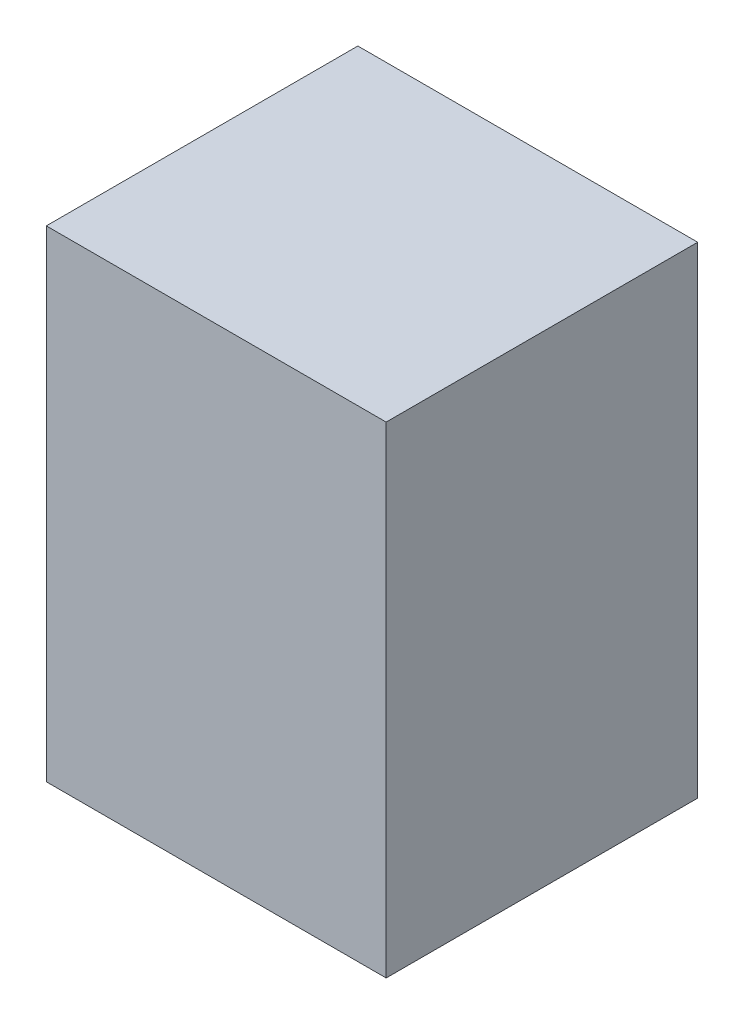
ISO-10303-21;
HEADER;
FILE_DESCRIPTION(('STEP AP214'),'2;1');
FILE_NAME('part.step','',(''),(''),'','','');
FILE_SCHEMA(('AUTOMOTIVE_DESIGN { 1 0 10303 214 1 1 1 1 }'));
ENDSEC;
DATA;
#1=APPLICATION_CONTEXT('core data for automotive mechanical design processes');
#2=APPLICATION_PROTOCOL_DEFINITION('international standard','automotive_design',2000,#1);
#3=PRODUCT_CONTEXT('',#1,'mechanical');
#4=PRODUCT('Part','Part','',(#3));
#5=PRODUCT_RELATED_PRODUCT_CATEGORY('part','',(#4));
#6=PRODUCT_DEFINITION_FORMATION('','',#4);
#7=PRODUCT_DEFINITION_CONTEXT('part definition',#1,'design');
#8=PRODUCT_DEFINITION('design','',#6,#7);
#9=PRODUCT_DEFINITION_SHAPE('','',#8);
#10=(LENGTH_UNIT() NAMED_UNIT(*) SI_UNIT(.MILLI.,.METRE.));
#11=(NAMED_UNIT(*) PLANE_ANGLE_UNIT() SI_UNIT($,.RADIAN.));
#12=(NAMED_UNIT(*) SI_UNIT($,.STERADIAN.) SOLID_ANGLE_UNIT());
#13=UNCERTAINTY_MEASURE_WITH_UNIT(LENGTH_MEASURE(1.E-05),#10,'distance_accuracy_value','');
#14=(GEOMETRIC_REPRESENTATION_CONTEXT(3) GLOBAL_UNCERTAINTY_ASSIGNED_CONTEXT((#13)) GLOBAL_UNIT_ASSIGNED_CONTEXT((#10,
#11,#12)) REPRESENTATION_CONTEXT('',''));
#15=CARTESIAN_POINT('',(0.,0.,0.));
#16=DIRECTION('',(0.,0.,1.));
#17=DIRECTION('',(1.,0.,0.));
#18=AXIS2_PLACEMENT_3D('',#15,#16,#17);
#19=CARTESIAN_POINT('',(4.1,15.,4.1));
#20=DIRECTION('',(0.,-1.,0.));
#21=DIRECTION('',(0.,0.,-1.));
#22=AXIS2_PLACEMENT_3D('',#19,#20,#21);
#23=PLANE('',#22);
#24=DIRECTION('',(-1.,0.,0.));
#25=VECTOR('',#24,1.);
#26=CARTESIAN_POINT('',(4.1,15.,4.1));
#27=LINE('',#26,#25);
#28=CARTESIAN_POINT('',(2.97988901220869,15.,4.1));
#29=VERTEX_POINT('',#28);
#30=CARTESIAN_POINT('',(-2.97988901220868,15.,4.1));
#31=VERTEX_POINT('',#30);
#32=EDGE_CURVE('E168',#29,#31,#27,.T.);
#33=ORIENTED_EDGE('',*,*,#32,.T.);
#34=DIRECTION('',(0.664178367353853,0.,0.747574141031623));
#35=VECTOR('',#34,1.);
#36=CARTESIAN_POINT('',(0.143282985343345,15.,7.61532470511805));
#37=LINE('',#36,#35);
#38=CARTESIAN_POINT('',(-4.1,15.,2.83924528301889));
#39=VERTEX_POINT('',#38);
#40=EDGE_CURVE('E38',#31,#39,#37,.F.);
#41=ORIENTED_EDGE('',*,*,#40,.T.);
#42=DIRECTION('',(0.,0.,-1.));
#43=VECTOR('',#42,1.);
#44=CARTESIAN_POINT('',(-4.1,15.,4.1));
#45=LINE('',#44,#43);
#46=CARTESIAN_POINT('',(-4.1,15.,-4.1));
#47=VERTEX_POINT('',#46);
#48=EDGE_CURVE('E171',#39,#47,#45,.T.);
#49=ORIENTED_EDGE('',*,*,#48,.T.);
#50=DIRECTION('',(1.,0.,0.));
#51=VECTOR('',#50,1.);
#52=CARTESIAN_POINT('',(-4.1,15.,-4.1));
#53=LINE('',#52,#51);
#54=CARTESIAN_POINT('',(4.1,15.,-4.1));
#55=VERTEX_POINT('',#54);
#56=EDGE_CURVE('E173',#47,#55,#53,.T.);
#57=ORIENTED_EDGE('',*,*,#56,.T.);
#58=DIRECTION('',(0.,0.,1.));
#59=VECTOR('',#58,1.);
#60=CARTESIAN_POINT('',(4.1,15.,-4.1));
#61=LINE('',#60,#59);
#62=CARTESIAN_POINT('',(4.1,15.,2.83924528301889));
#63=VERTEX_POINT('',#62);
#64=EDGE_CURVE('E165',#55,#63,#61,.T.);
#65=ORIENTED_EDGE('',*,*,#64,.T.);
#66=DIRECTION('',(0.664178367353848,0.,-0.747574141031628));
#67=VECTOR('',#66,1.);
#68=CARTESIAN_POINT('',(3.47400682467546,15.,3.54383961089404));
#69=LINE('',#68,#67);
#70=EDGE_CURVE('E223',#63,#29,#69,.F.);
#71=ORIENTED_EDGE('',*,*,#70,.T.);
#72=EDGE_LOOP('',(#33,#41,#49,#57,#65,#71));
#73=FACE_BOUND('',#72,.T.);
#74=DIRECTION('',(1.,0.,0.));
#75=VECTOR('',#74,1.);
#76=CARTESIAN_POINT('',(3.,15.,-1.5));
#77=LINE('',#76,#75);
#78=CARTESIAN_POINT('',(-3.,15.,-1.5));
#79=VERTEX_POINT('',#78);
#80=CARTESIAN_POINT('',(3.,15.,-1.5));
#81=VERTEX_POINT('',#80);
#82=EDGE_CURVE('E427',#79,#81,#77,.T.);
#83=ORIENTED_EDGE('',*,*,#82,.F.);
#84=DIRECTION('',(0.,0.,-1.));
#85=VECTOR('',#84,1.);
#86=CARTESIAN_POINT('',(-3.,15.,-1.5));
#87=LINE('',#86,#85);
#88=CARTESIAN_POINT('',(-3.,15.,1.5));
#89=VERTEX_POINT('',#88);
#90=EDGE_CURVE('E154',#89,#79,#87,.T.);
#91=ORIENTED_EDGE('',*,*,#90,.F.);
#92=DIRECTION('',(-1.,0.,0.));
#93=VECTOR('',#92,1.);
#94=CARTESIAN_POINT('',(-3.,15.,1.5));
#95=LINE('',#94,#93);
#96=CARTESIAN_POINT('',(3.,15.,1.5));
#97=VERTEX_POINT('',#96);
#98=EDGE_CURVE('E150',#97,#89,#95,.T.);
#99=ORIENTED_EDGE('',*,*,#98,.F.);
#100=DIRECTION('',(0.,0.,1.));
#101=VECTOR('',#100,1.);
#102=CARTESIAN_POINT('',(3.,15.,1.5));
#103=LINE('',#102,#101);
#104=EDGE_CURVE('E424',#81,#97,#103,.T.);
#105=ORIENTED_EDGE('',*,*,#104,.F.);
#106=EDGE_LOOP('',(#83,#91,#99,#105));
#107=FACE_BOUND('',#106,.T.);
#108=ADVANCED_FACE('F30',(#73,#107),#23,.T.);
#109=CARTESIAN_POINT('',(6.,17.,5.5));
#110=DIRECTION('',(1.,0.,0.));
#111=DIRECTION('',(0.,0.,-1.));
#112=AXIS2_PLACEMENT_3D('',#109,#110,#111);
#113=PLANE('',#112);
#114=DIRECTION('',(0.,-1.,0.));
#115=VECTOR('',#114,1.);
#116=CARTESIAN_POINT('',(6.,17.,-5.5));
#117=LINE('',#116,#115);
#118=CARTESIAN_POINT('',(6.,17.,-5.5));
#119=VERTEX_POINT('',#118);
#120=CARTESIAN_POINT('',(6.,0.,-5.5));
#121=VERTEX_POINT('',#120);
#122=EDGE_CURVE('E184',#119,#121,#117,.T.);
#123=ORIENTED_EDGE('',*,*,#122,.F.);
#124=DIRECTION('',(0.,0.,-1.));
#125=VECTOR('',#124,1.);
#126=CARTESIAN_POINT('',(6.,17.,5.5));
#127=LINE('',#126,#125);
#128=CARTESIAN_POINT('',(6.,17.,5.5));
#129=VERTEX_POINT('',#128);
#130=EDGE_CURVE('E211',#129,#119,#127,.T.);
#131=ORIENTED_EDGE('',*,*,#130,.F.);
#132=DIRECTION('',(0.,-1.,0.));
#133=VECTOR('',#132,1.);
#134=CARTESIAN_POINT('',(6.,17.,5.5));
#135=LINE('',#134,#133);
#136=CARTESIAN_POINT('',(6.,0.,5.5));
#137=VERTEX_POINT('',#136);
#138=EDGE_CURVE('E187',#129,#137,#135,.T.);
#139=ORIENTED_EDGE('',*,*,#138,.T.);
#140=DIRECTION('',(0.,0.,-1.));
#141=VECTOR('',#140,1.);
#142=CARTESIAN_POINT('',(6.,0.,5.5));
#143=LINE('',#142,#141);
#144=EDGE_CURVE('E200',#137,#121,#143,.T.);
#145=ORIENTED_EDGE('',*,*,#144,.T.);
#146=EDGE_LOOP('',(#123,#131,#139,#145));
#147=FACE_BOUND('',#146,.T.);
#148=ADVANCED_FACE('F247',(#147),#113,.T.);
#149=CARTESIAN_POINT('',(-6.,17.,5.5));
#150=DIRECTION('',(0.,1.,0.));
#151=DIRECTION('',(0.,0.,1.));
#152=AXIS2_PLACEMENT_3D('',#149,#150,#151);
#153=PLANE('',#152);
#154=DIRECTION('',(1.,0.,0.));
#155=VECTOR('',#154,1.);
#156=CARTESIAN_POINT('',(-6.,17.,-5.5));
#157=LINE('',#156,#155);
#158=CARTESIAN_POINT('',(-6.,17.,-5.5));
#159=VERTEX_POINT('',#158);
#160=EDGE_CURVE('E191',#159,#119,#157,.T.);
#161=ORIENTED_EDGE('',*,*,#160,.F.);
#162=DIRECTION('',(0.,0.,-1.));
#163=VECTOR('',#162,1.);
#164=CARTESIAN_POINT('',(-6.,17.,5.5));
#165=LINE('',#164,#163);
#166=CARTESIAN_POINT('',(-6.,17.,5.5));
#167=VERTEX_POINT('',#166);
#168=EDGE_CURVE('E214',#167,#159,#165,.T.);
#169=ORIENTED_EDGE('',*,*,#168,.F.);
#170=DIRECTION('',(1.,0.,0.));
#171=VECTOR('',#170,1.);
#172=CARTESIAN_POINT('',(-6.,17.,5.5));
#173=LINE('',#172,#171);
#174=EDGE_CURVE('E197',#167,#129,#173,.T.);
#175=ORIENTED_EDGE('',*,*,#174,.T.);
#176=ORIENTED_EDGE('',*,*,#130,.T.);
#177=EDGE_LOOP('',(#161,#169,#175,#176));
#178=FACE_BOUND('',#177,.T.);
#179=ADVANCED_FACE('F252',(#178),#153,.T.);
#180=CARTESIAN_POINT('',(-6.,0.,5.5));
#181=DIRECTION('',(-1.,0.,0.));
#182=DIRECTION('',(0.,0.,1.));
#183=AXIS2_PLACEMENT_3D('',#180,#181,#182);
#184=PLANE('',#183);
#185=DIRECTION('',(0.,1.,0.));
#186=VECTOR('',#185,1.);
#187=CARTESIAN_POINT('',(-6.,0.,-5.5));
#188=LINE('',#187,#186);
#189=CARTESIAN_POINT('',(-6.,0.,-5.5));
#190=VERTEX_POINT('',#189);
#191=EDGE_CURVE('E206',#190,#159,#188,.T.);
#192=ORIENTED_EDGE('',*,*,#191,.F.);
#193=DIRECTION('',(0.,0.,-1.));
#194=VECTOR('',#193,1.);
#195=CARTESIAN_POINT('',(-6.,0.,5.5));
#196=LINE('',#195,#194);
#197=CARTESIAN_POINT('',(-6.,0.,5.5));
#198=VERTEX_POINT('',#197);
#199=EDGE_CURVE('E216',#198,#190,#196,.T.);
#200=ORIENTED_EDGE('',*,*,#199,.F.);
#201=DIRECTION('',(0.,1.,0.));
#202=VECTOR('',#201,1.);
#203=CARTESIAN_POINT('',(-6.,0.,5.5));
#204=LINE('',#203,#202);
#205=EDGE_CURVE('E194',#198,#167,#204,.T.);
#206=ORIENTED_EDGE('',*,*,#205,.T.);
#207=ORIENTED_EDGE('',*,*,#168,.T.);
#208=EDGE_LOOP('',(#192,#200,#206,#207));
#209=FACE_BOUND('',#208,.T.);
#210=ADVANCED_FACE('F282',(#209),#184,.T.);
#211=CARTESIAN_POINT('',(6.,0.,5.5));
#212=DIRECTION('',(0.,-1.,0.));
#213=DIRECTION('',(0.,0.,-1.));
#214=AXIS2_PLACEMENT_3D('',#211,#212,#213);
#215=PLANE('',#214);
#216=DIRECTION('',(0.,0.,1.));
#217=VECTOR('',#216,1.);
#218=CARTESIAN_POINT('',(4.1,0.,-4.1));
#219=LINE('',#218,#217);
#220=CARTESIAN_POINT('',(4.1,0.,-4.1));
#221=VERTEX_POINT('',#220);
#222=CARTESIAN_POINT('',(4.1,0.,2.83924528301889));
#223=VERTEX_POINT('',#222);
#224=EDGE_CURVE('E156',#221,#223,#219,.T.);
#225=ORIENTED_EDGE('',*,*,#224,.F.);
#226=DIRECTION('',(1.,0.,0.));
#227=VECTOR('',#226,1.);
#228=CARTESIAN_POINT('',(-4.1,0.,-4.1));
#229=LINE('',#228,#227);
#230=CARTESIAN_POINT('',(-4.1,0.,-4.1));
#231=VERTEX_POINT('',#230);
#232=EDGE_CURVE('E169',#231,#221,#229,.T.);
#233=ORIENTED_EDGE('',*,*,#232,.F.);
#234=DIRECTION('',(0.,0.,-1.));
#235=VECTOR('',#234,1.);
#236=CARTESIAN_POINT('',(-4.1,0.,4.1));
#237=LINE('',#236,#235);
#238=CARTESIAN_POINT('',(-4.1,0.,2.83924528301889));
#239=VERTEX_POINT('',#238);
#240=EDGE_CURVE('E178',#239,#231,#237,.T.);
#241=ORIENTED_EDGE('',*,*,#240,.F.);
#242=DIRECTION('',(-0.664178367353853,0.,-0.747574141031623));
#243=VECTOR('',#242,1.);
#244=CARTESIAN_POINT('',(-4.1,0.,2.83924528301889));
#245=LINE('',#244,#243);
#246=CARTESIAN_POINT('',(-2.97988901220868,0.,4.1));
#247=VERTEX_POINT('',#246);
#248=EDGE_CURVE('E11',#239,#247,#245,.F.);
#249=ORIENTED_EDGE('',*,*,#248,.T.);
#250=DIRECTION('',(-1.,0.,0.));
#251=VECTOR('',#250,1.);
#252=CARTESIAN_POINT('',(4.1,0.,4.1));
#253=LINE('',#252,#251);
#254=CARTESIAN_POINT('',(2.97988901220869,0.,4.1));
#255=VERTEX_POINT('',#254);
#256=EDGE_CURVE('E159',#255,#247,#253,.T.);
#257=ORIENTED_EDGE('',*,*,#256,.F.);
#258=DIRECTION('',(-0.664178367353848,0.,0.747574141031628));
#259=VECTOR('',#258,1.);
#260=CARTESIAN_POINT('',(2.97988901220869,0.,4.1));
#261=LINE('',#260,#259);
#262=EDGE_CURVE('E225',#255,#223,#261,.F.);
#263=ORIENTED_EDGE('',*,*,#262,.T.);
#264=EDGE_LOOP('',(#225,#233,#241,#249,#257,#263));
#265=FACE_BOUND('',#264,.T.);
#266=DIRECTION('',(-1.,0.,0.));
#267=VECTOR('',#266,1.);
#268=CARTESIAN_POINT('',(6.,0.,-5.5));
#269=LINE('',#268,#267);
#270=EDGE_CURVE('E203',#121,#190,#269,.T.);
#271=ORIENTED_EDGE('',*,*,#270,.F.);
#272=ORIENTED_EDGE('',*,*,#144,.F.);
#273=DIRECTION('',(-1.,0.,0.));
#274=VECTOR('',#273,1.);
#275=CARTESIAN_POINT('',(6.,0.,5.5));
#276=LINE('',#275,#274);
#277=EDGE_CURVE('E190',#137,#198,#276,.T.);
#278=ORIENTED_EDGE('',*,*,#277,.T.);
#279=ORIENTED_EDGE('',*,*,#199,.T.);
#280=EDGE_LOOP('',(#271,#272,#278,#279));
#281=FACE_BOUND('',#280,.T.);
#282=ADVANCED_FACE('F275',(#265,#281),#215,.T.);
#283=CARTESIAN_POINT('',(6.,0.,5.5));
#284=DIRECTION('',(0.,0.,-1.));
#285=DIRECTION('',(-1.,0.,0.));
#286=AXIS2_PLACEMENT_3D('',#283,#284,#285);
#287=PLANE('',#286);
#288=ORIENTED_EDGE('',*,*,#138,.F.);
#289=ORIENTED_EDGE('',*,*,#174,.F.);
#290=ORIENTED_EDGE('',*,*,#205,.F.);
#291=ORIENTED_EDGE('',*,*,#277,.F.);
#292=EDGE_LOOP('',(#288,#289,#290,#291));
#293=FACE_BOUND('',#292,.T.);
#294=ADVANCED_FACE('F272',(#293),#287,.F.);
#295=CARTESIAN_POINT('',(6.,0.,-5.5));
#296=DIRECTION('',(0.,0.,-1.));
#297=DIRECTION('',(-1.,0.,0.));
#298=AXIS2_PLACEMENT_3D('',#295,#296,#297);
#299=PLANE('',#298);
#300=ORIENTED_EDGE('',*,*,#122,.T.);
#301=ORIENTED_EDGE('',*,*,#270,.T.);
#302=ORIENTED_EDGE('',*,*,#191,.T.);
#303=ORIENTED_EDGE('',*,*,#160,.T.);
#304=EDGE_LOOP('',(#300,#301,#302,#303));
#305=FACE_BOUND('',#304,.T.);
#306=ADVANCED_FACE('F270',(#305),#299,.T.);
#307=CARTESIAN_POINT('',(4.1,15.,-4.1));
#308=DIRECTION('',(1.,0.,0.));
#309=DIRECTION('',(0.,0.,-1.));
#310=AXIS2_PLACEMENT_3D('',#307,#308,#309);
#311=PLANE('',#310);
#312=ORIENTED_EDGE('',*,*,#224,.T.);
#313=DIRECTION('',(0.,1.,0.));
#314=VECTOR('',#313,1.);
#315=CARTESIAN_POINT('',(4.1,15.,2.83924528301889));
#316=LINE('',#315,#314);
#317=EDGE_CURVE('E221',#223,#63,#316,.T.);
#318=ORIENTED_EDGE('',*,*,#317,.T.);
#319=ORIENTED_EDGE('',*,*,#64,.F.);
#320=DIRECTION('',(0.,-1.,0.));
#321=VECTOR('',#320,1.);
#322=CARTESIAN_POINT('',(4.1,15.,-4.1));
#323=LINE('',#322,#321);
#324=EDGE_CURVE('E182',#55,#221,#323,.T.);
#325=ORIENTED_EDGE('',*,*,#324,.T.);
#326=EDGE_LOOP('',(#312,#318,#319,#325));
#327=FACE_BOUND('',#326,.T.);
#328=ADVANCED_FACE('F261',(#327),#311,.F.);
#329=CARTESIAN_POINT('',(-4.1,15.,-4.1));
#330=DIRECTION('',(0.,0.,-1.));
#331=DIRECTION('',(-1.,0.,0.));
#332=AXIS2_PLACEMENT_3D('',#329,#330,#331);
#333=PLANE('',#332);
#334=ORIENTED_EDGE('',*,*,#232,.T.);
#335=ORIENTED_EDGE('',*,*,#324,.F.);
#336=ORIENTED_EDGE('',*,*,#56,.F.);
#337=DIRECTION('',(0.,-1.,0.));
#338=VECTOR('',#337,1.);
#339=CARTESIAN_POINT('',(-4.1,15.,-4.1));
#340=LINE('',#339,#338);
#341=EDGE_CURVE('E175',#47,#231,#340,.T.);
#342=ORIENTED_EDGE('',*,*,#341,.T.);
#343=EDGE_LOOP('',(#334,#335,#336,#342));
#344=FACE_BOUND('',#343,.T.);
#345=ADVANCED_FACE('F258',(#344),#333,.F.);
#346=CARTESIAN_POINT('',(-4.1,15.,4.1));
#347=DIRECTION('',(-1.,0.,0.));
#348=DIRECTION('',(0.,0.,1.));
#349=AXIS2_PLACEMENT_3D('',#346,#347,#348);
#350=PLANE('',#349);
#351=ORIENTED_EDGE('',*,*,#48,.F.);
#352=DIRECTION('',(0.,-1.,0.));
#353=VECTOR('',#352,1.);
#354=CARTESIAN_POINT('',(-4.1,0.,2.83924528301889));
#355=LINE('',#354,#353);
#356=EDGE_CURVE('E227',#39,#239,#355,.T.);
#357=ORIENTED_EDGE('',*,*,#356,.T.);
#358=ORIENTED_EDGE('',*,*,#240,.T.);
#359=ORIENTED_EDGE('',*,*,#341,.F.);
#360=EDGE_LOOP('',(#351,#357,#358,#359));
#361=FACE_BOUND('',#360,.T.);
#362=ADVANCED_FACE('F238',(#361),#350,.F.);
#363=CARTESIAN_POINT('',(4.1,15.,4.1));
#364=DIRECTION('',(0.,0.,1.));
#365=DIRECTION('',(1.,0.,0.));
#366=AXIS2_PLACEMENT_3D('',#363,#364,#365);
#367=PLANE('',#366);
#368=ORIENTED_EDGE('',*,*,#256,.T.);
#369=DIRECTION('',(0.,1.,0.));
#370=VECTOR('',#369,1.);
#371=CARTESIAN_POINT('',(-2.97988901220868,15.,4.1));
#372=LINE('',#371,#370);
#373=EDGE_CURVE('E50',#247,#31,#372,.T.);
#374=ORIENTED_EDGE('',*,*,#373,.T.);
#375=ORIENTED_EDGE('',*,*,#32,.F.);
#376=DIRECTION('',(0.,-1.,0.));
#377=VECTOR('',#376,1.);
#378=CARTESIAN_POINT('',(2.97988901220869,0.,4.1));
#379=LINE('',#378,#377);
#380=EDGE_CURVE('E213',#29,#255,#379,.T.);
#381=ORIENTED_EDGE('',*,*,#380,.T.);
#382=EDGE_LOOP('',(#368,#374,#375,#381));
#383=FACE_BOUND('',#382,.T.);
#384=ADVANCED_FACE('F265',(#383),#367,.F.);
#385=CARTESIAN_POINT('',(-3.,0.,-1.5));
#386=DIRECTION('',(1.,0.,0.));
#387=DIRECTION('',(0.,0.,-1.));
#388=AXIS2_PLACEMENT_3D('',#385,#386,#387);
#389=PLANE('',#388);
#390=ORIENTED_EDGE('',*,*,#90,.T.);
#391=DIRECTION('',(0.,1.,0.));
#392=VECTOR('',#391,1.);
#393=CARTESIAN_POINT('',(-3.,0.,-1.5));
#394=LINE('',#393,#392);
#395=CARTESIAN_POINT('',(-3.,0.,-1.5));
#396=VERTEX_POINT('',#395);
#397=EDGE_CURVE('E134',#396,#79,#394,.T.);
#398=ORIENTED_EDGE('',*,*,#397,.F.);
#399=DIRECTION('',(0.,0.,-1.));
#400=VECTOR('',#399,1.);
#401=CARTESIAN_POINT('',(-3.,0.,-1.5));
#402=LINE('',#401,#400);
#403=CARTESIAN_POINT('',(-3.,0.,1.5));
#404=VERTEX_POINT('',#403);
#405=EDGE_CURVE('E141',#404,#396,#402,.T.);
#406=ORIENTED_EDGE('',*,*,#405,.F.);
#407=DIRECTION('',(0.,1.,0.));
#408=VECTOR('',#407,1.);
#409=CARTESIAN_POINT('',(-3.,0.,1.5));
#410=LINE('',#409,#408);
#411=EDGE_CURVE('E420',#404,#89,#410,.T.);
#412=ORIENTED_EDGE('',*,*,#411,.T.);
#413=EDGE_LOOP('',(#390,#398,#406,#412));
#414=FACE_BOUND('',#413,.T.);
#415=ADVANCED_FACE('F152',(#414),#389,.F.);
#416=CARTESIAN_POINT('',(3.,0.,-1.5));
#417=DIRECTION('',(0.,0.,1.));
#418=DIRECTION('',(1.,0.,0.));
#419=AXIS2_PLACEMENT_3D('',#416,#417,#418);
#420=PLANE('',#419);
#421=ORIENTED_EDGE('',*,*,#82,.T.);
#422=DIRECTION('',(0.,1.,0.));
#423=VECTOR('',#422,1.);
#424=CARTESIAN_POINT('',(3.,0.,-1.5));
#425=LINE('',#424,#423);
#426=CARTESIAN_POINT('',(3.,0.,-1.5));
#427=VERTEX_POINT('',#426);
#428=EDGE_CURVE('E137',#427,#81,#425,.T.);
#429=ORIENTED_EDGE('',*,*,#428,.F.);
#430=DIRECTION('',(1.,0.,0.));
#431=VECTOR('',#430,1.);
#432=CARTESIAN_POINT('',(3.,0.,-1.5));
#433=LINE('',#432,#431);
#434=EDGE_CURVE('E130',#396,#427,#433,.T.);
#435=ORIENTED_EDGE('',*,*,#434,.F.);
#436=ORIENTED_EDGE('',*,*,#397,.T.);
#437=EDGE_LOOP('',(#421,#429,#435,#436));
#438=FACE_BOUND('',#437,.T.);
#439=ADVANCED_FACE('F132',(#438),#420,.F.);
#440=CARTESIAN_POINT('',(3.,0.,1.5));
#441=DIRECTION('',(-1.,0.,0.));
#442=DIRECTION('',(0.,0.,1.));
#443=AXIS2_PLACEMENT_3D('',#440,#441,#442);
#444=PLANE('',#443);
#445=ORIENTED_EDGE('',*,*,#104,.T.);
#446=DIRECTION('',(0.,1.,0.));
#447=VECTOR('',#446,1.);
#448=CARTESIAN_POINT('',(3.,0.,1.5));
#449=LINE('',#448,#447);
#450=CARTESIAN_POINT('',(3.,0.,1.5));
#451=VERTEX_POINT('',#450);
#452=EDGE_CURVE('E161',#451,#97,#449,.T.);
#453=ORIENTED_EDGE('',*,*,#452,.F.);
#454=DIRECTION('',(0.,0.,1.));
#455=VECTOR('',#454,1.);
#456=CARTESIAN_POINT('',(3.,0.,1.5));
#457=LINE('',#456,#455);
#458=EDGE_CURVE('E140',#427,#451,#457,.T.);
#459=ORIENTED_EDGE('',*,*,#458,.F.);
#460=ORIENTED_EDGE('',*,*,#428,.T.);
#461=EDGE_LOOP('',(#445,#453,#459,#460));
#462=FACE_BOUND('',#461,.T.);
#463=ADVANCED_FACE('F344',(#462),#444,.F.);
#464=CARTESIAN_POINT('',(-3.,0.,1.5));
#465=DIRECTION('',(0.,0.,-1.));
#466=DIRECTION('',(-1.,0.,0.));
#467=AXIS2_PLACEMENT_3D('',#464,#465,#466);
#468=PLANE('',#467);
#469=ORIENTED_EDGE('',*,*,#98,.T.);
#470=ORIENTED_EDGE('',*,*,#411,.F.);
#471=DIRECTION('',(-1.,0.,0.));
#472=VECTOR('',#471,1.);
#473=CARTESIAN_POINT('',(-3.,0.,1.5));
#474=LINE('',#473,#472);
#475=EDGE_CURVE('E146',#451,#404,#474,.T.);
#476=ORIENTED_EDGE('',*,*,#475,.F.);
#477=ORIENTED_EDGE('',*,*,#452,.T.);
#478=EDGE_LOOP('',(#469,#470,#476,#477));
#479=FACE_BOUND('',#478,.T.);
#480=ADVANCED_FACE('F350',(#479),#468,.F.);
#481=CARTESIAN_POINT('',(-3.,0.,1.5));
#482=DIRECTION('',(0.,1.,0.));
#483=DIRECTION('',(0.,0.,1.));
#484=AXIS2_PLACEMENT_3D('',#481,#482,#483);
#485=PLANE('',#484);
#486=ORIENTED_EDGE('',*,*,#405,.T.);
#487=ORIENTED_EDGE('',*,*,#434,.T.);
#488=ORIENTED_EDGE('',*,*,#458,.T.);
#489=ORIENTED_EDGE('',*,*,#475,.T.);
#490=EDGE_LOOP('',(#486,#487,#488,#489));
#491=FACE_BOUND('',#490,.T.);
#492=ADVANCED_FACE('F144',(#491),#485,.F.);
#493=CARTESIAN_POINT('',(2.97988901220869,15.,4.1));
#494=DIRECTION('',(-0.747574141031628,0.,-0.664178367353848));
#495=DIRECTION('',(-0.664178367353848,0.,0.747574141031628));
#496=AXIS2_PLACEMENT_3D('',#493,#494,#495);
#497=PLANE('',#496);
#498=ORIENTED_EDGE('',*,*,#70,.F.);
#499=ORIENTED_EDGE('',*,*,#317,.F.);
#500=ORIENTED_EDGE('',*,*,#262,.F.);
#501=ORIENTED_EDGE('',*,*,#380,.F.);
#502=EDGE_LOOP('',(#498,#499,#500,#501));
#503=FACE_BOUND('',#502,.T.);
#504=ADVANCED_FACE('F241',(#503),#497,.T.);
#505=CARTESIAN_POINT('',(-4.1,15.,2.83924528301889));
#506=DIRECTION('',(0.747574141031623,0.,-0.664178367353853));
#507=DIRECTION('',(-0.664178367353853,0.,-0.747574141031623));
#508=AXIS2_PLACEMENT_3D('',#505,#506,#507);
#509=PLANE('',#508);
#510=ORIENTED_EDGE('',*,*,#40,.F.);
#511=ORIENTED_EDGE('',*,*,#373,.F.);
#512=ORIENTED_EDGE('',*,*,#248,.F.);
#513=ORIENTED_EDGE('',*,*,#356,.F.);
#514=EDGE_LOOP('',(#510,#511,#512,#513));
#515=FACE_BOUND('',#514,.T.);
#516=ADVANCED_FACE('F32',(#515),#509,.T.);
#517=CLOSED_SHELL('',(#108,#148,#179,#210,#282,#294,#306,#328,#345,#362,#384,#415,#439,#463,
#480,#492,#504,#516));
#518=MANIFOLD_SOLID_BREP('B2',#517);
#519=ADVANCED_BREP_SHAPE_REPRESENTATION('',(#18,#518),#14);
#520=SHAPE_DEFINITION_REPRESENTATION(#9,#519);
ENDSEC;
END-ISO-10303-21;
